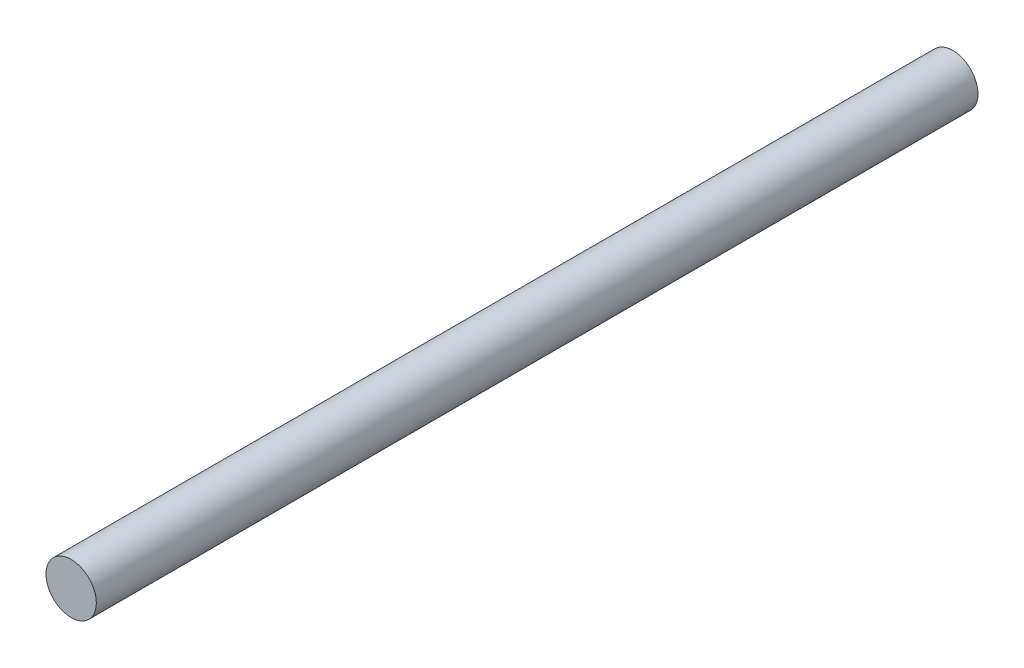
ISO-10303-21;
HEADER;
FILE_DESCRIPTION(('STEP AP214'),'2;1');
FILE_NAME('part.step','',(''),(''),'','','');
FILE_SCHEMA(('AUTOMOTIVE_DESIGN { 1 0 10303 214 1 1 1 1 }'));
ENDSEC;
DATA;
#1=APPLICATION_CONTEXT('core data for automotive mechanical design processes');
#2=APPLICATION_PROTOCOL_DEFINITION('international standard','automotive_design',2000,#1);
#3=PRODUCT_CONTEXT('',#1,'mechanical');
#4=PRODUCT('Part','Part','',(#3));
#5=PRODUCT_RELATED_PRODUCT_CATEGORY('part','',(#4));
#6=PRODUCT_DEFINITION_FORMATION('','',#4);
#7=PRODUCT_DEFINITION_CONTEXT('part definition',#1,'design');
#8=PRODUCT_DEFINITION('design','',#6,#7);
#9=PRODUCT_DEFINITION_SHAPE('','',#8);
#10=(LENGTH_UNIT() NAMED_UNIT(*) SI_UNIT(.MILLI.,.METRE.));
#11=(NAMED_UNIT(*) PLANE_ANGLE_UNIT() SI_UNIT($,.RADIAN.));
#12=(NAMED_UNIT(*) SI_UNIT($,.STERADIAN.) SOLID_ANGLE_UNIT());
#13=UNCERTAINTY_MEASURE_WITH_UNIT(LENGTH_MEASURE(1.E-05),#10,'distance_accuracy_value','');
#14=(GEOMETRIC_REPRESENTATION_CONTEXT(3) GLOBAL_UNCERTAINTY_ASSIGNED_CONTEXT((#13)) GLOBAL_UNIT_ASSIGNED_CONTEXT((#10,
#11,#12)) REPRESENTATION_CONTEXT('',''));
#15=CARTESIAN_POINT('',(0.,0.,0.));
#16=DIRECTION('',(0.,0.,1.));
#17=DIRECTION('',(1.,0.,0.));
#18=AXIS2_PLACEMENT_3D('',#15,#16,#17);
#19=CARTESIAN_POINT('',(0.,0.,70.));
#20=DIRECTION('',(0.,0.,-1.));
#21=DIRECTION('',(-1.,0.,0.));
#22=AXIS2_PLACEMENT_3D('',#19,#20,#21);
#23=CYLINDRICAL_SURFACE('',#22,2.);
#24=CARTESIAN_POINT('',(0.,0.,70.));
#25=DIRECTION('',(0.,0.,1.));
#26=DIRECTION('',(1.,0.,0.));
#27=AXIS2_PLACEMENT_3D('',#24,#25,#26);
#28=CIRCLE('',#27,2.);
#29=CARTESIAN_POINT('',(2.,0.,70.));
#30=VERTEX_POINT('',#29);
#31=EDGE_CURVE('E10',#30,#30,#28,.T.);
#32=ORIENTED_EDGE('',*,*,#31,.F.);
#33=EDGE_LOOP('',(#32));
#34=FACE_BOUND('',#33,.T.);
#35=CARTESIAN_POINT('',(0.,0.,0.));
#36=DIRECTION('',(0.,0.,1.));
#37=DIRECTION('',(1.,0.,0.));
#38=AXIS2_PLACEMENT_3D('',#35,#36,#37);
#39=CIRCLE('',#38,2.);
#40=CARTESIAN_POINT('',(2.,0.,0.));
#41=VERTEX_POINT('',#40);
#42=EDGE_CURVE('E33',#41,#41,#39,.T.);
#43=ORIENTED_EDGE('',*,*,#42,.T.);
#44=EDGE_LOOP('',(#43));
#45=FACE_BOUND('',#44,.T.);
#46=ADVANCED_FACE('F30',(#34,#45),#23,.T.);
#47=CARTESIAN_POINT('',(0.,0.,70.));
#48=DIRECTION('',(0.,0.,1.));
#49=DIRECTION('',(1.,0.,0.));
#50=AXIS2_PLACEMENT_3D('',#47,#48,#49);
#51=PLANE('',#50);
#52=ORIENTED_EDGE('',*,*,#31,.T.);
#53=EDGE_LOOP('',(#52));
#54=FACE_BOUND('',#53,.T.);
#55=ADVANCED_FACE('F45',(#54),#51,.T.);
#56=CARTESIAN_POINT('',(0.,0.,0.));
#57=DIRECTION('',(0.,0.,1.));
#58=DIRECTION('',(1.,0.,0.));
#59=AXIS2_PLACEMENT_3D('',#56,#57,#58);
#60=PLANE('',#59);
#61=ORIENTED_EDGE('',*,*,#42,.F.);
#62=EDGE_LOOP('',(#61));
#63=FACE_BOUND('',#62,.T.);
#64=ADVANCED_FACE('F43',(#63),#60,.F.);
#65=CLOSED_SHELL('',(#46,#55,#64));
#66=MANIFOLD_SOLID_BREP('B2',#65);
#67=ADVANCED_BREP_SHAPE_REPRESENTATION('',(#18,#66),#14);
#68=SHAPE_DEFINITION_REPRESENTATION(#9,#67);
ENDSEC;
END-ISO-10303-21;
